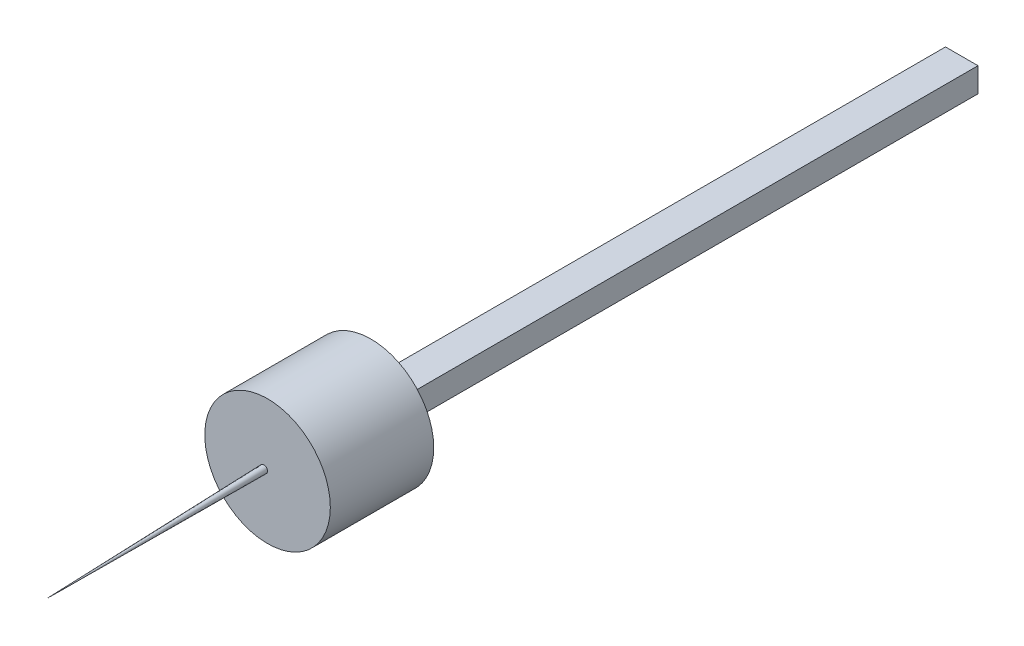
ISO-10303-21;
HEADER;
FILE_DESCRIPTION(('STEP AP214'),'2;1');
FILE_NAME('part.step','',(''),(''),'','','');
FILE_SCHEMA(('AUTOMOTIVE_DESIGN { 1 0 10303 214 1 1 1 1 }'));
ENDSEC;
DATA;
#1=APPLICATION_CONTEXT('core data for automotive mechanical design processes');
#2=APPLICATION_PROTOCOL_DEFINITION('international standard','automotive_design',2000,#1);
#3=PRODUCT_CONTEXT('',#1,'mechanical');
#4=PRODUCT('Part','Part','',(#3));
#5=PRODUCT_RELATED_PRODUCT_CATEGORY('part','',(#4));
#6=PRODUCT_DEFINITION_FORMATION('','',#4);
#7=PRODUCT_DEFINITION_CONTEXT('part definition',#1,'design');
#8=PRODUCT_DEFINITION('design','',#6,#7);
#9=PRODUCT_DEFINITION_SHAPE('','',#8);
#10=(LENGTH_UNIT() NAMED_UNIT(*) SI_UNIT(.MILLI.,.METRE.));
#11=(NAMED_UNIT(*) PLANE_ANGLE_UNIT() SI_UNIT($,.RADIAN.));
#12=(NAMED_UNIT(*) SI_UNIT($,.STERADIAN.) SOLID_ANGLE_UNIT());
#13=UNCERTAINTY_MEASURE_WITH_UNIT(LENGTH_MEASURE(1.E-05),#10,'distance_accuracy_value','');
#14=(GEOMETRIC_REPRESENTATION_CONTEXT(3) GLOBAL_UNCERTAINTY_ASSIGNED_CONTEXT((#13)) GLOBAL_UNIT_ASSIGNED_CONTEXT((#10,
#11,#12)) REPRESENTATION_CONTEXT('',''));
#15=CARTESIAN_POINT('',(0.,0.,0.));
#16=DIRECTION('',(0.,0.,1.));
#17=DIRECTION('',(1.,0.,0.));
#18=AXIS2_PLACEMENT_3D('',#15,#16,#17);
#19=CARTESIAN_POINT('',(-0.5,0.,94.));
#20=DIRECTION('',(0.0166643523339935,0.,0.9998611400396));
#21=DIRECTION('',(0.9998611400396,0.,-0.0166643523339935));
#22=AXIS2_PLACEMENT_3D('',#19,#20,#21);
#23=CONICAL_SURFACE('',#22,0.,1.55413120308097);
#24=CARTESIAN_POINT('',(-0.499861149680644,0.,94.0083310191613));
#25=DIRECTION('',(0.0166643523339935,0.,0.9998611400396));
#26=DIRECTION('',(0.9998611400396,0.,-0.0166643523339935));
#27=AXIS2_PLACEMENT_3D('',#24,#25,#26);
#28=CIRCLE('',#27,0.4999305700198);
#29=CARTESIAN_POINT('',(0.,0.,94.));
#30=VERTEX_POINT('',#29);
#31=EDGE_CURVE('E12',#30,#30,#28,.T.);
#32=ORIENTED_EDGE('',*,*,#31,.F.);
#33=EDGE_LOOP('',(#32));
#34=FACE_BOUND('',#33,.T.);
#35=CARTESIAN_POINT('',(-0.5,0.,94.));
#36=VERTEX_POINT('',#35);
#37=VERTEX_LOOP('',#36);
#38=FACE_BOUND('',#37,.T.);
#39=ADVANCED_FACE('F47',(#34,#38),#23,.T.);
#40=CARTESIAN_POINT('',(-0.499861149680644,0.,94.0083310191613));
#41=DIRECTION('',(-0.0166643523339935,0.,-0.9998611400396));
#42=DIRECTION('',(-0.9998611400396,0.,0.0166643523339935));
#43=AXIS2_PLACEMENT_3D('',#40,#41,#42);
#44=CONICAL_SURFACE('',#43,0.4999305700198,0.0166651237139407);
#45=CARTESIAN_POINT('',(0.,0.,124.));
#46=VERTEX_POINT('',#45);
#47=VERTEX_LOOP('',#46);
#48=FACE_BOUND('',#47,.T.);
#49=ORIENTED_EDGE('',*,*,#31,.T.);
#50=EDGE_LOOP('',(#49));
#51=FACE_BOUND('',#50,.T.);
#52=ADVANCED_FACE('F59',(#48,#51),#44,.T.);
#53=CLOSED_SHELL('',(#39,#52));
#54=MANIFOLD_SOLID_BREP('B2',#53);
#55=CARTESIAN_POINT('',(2.2,-1.65,80.));
#56=DIRECTION('',(-1.,0.,0.));
#57=DIRECTION('',(0.,0.,1.));
#58=AXIS2_PLACEMENT_3D('',#55,#56,#57);
#59=PLANE('',#58);
#60=DIRECTION('',(0.,1.,0.));
#61=VECTOR('',#60,1.);
#62=CARTESIAN_POINT('',(2.2,-1.65,0.));
#63=LINE('',#62,#61);
#64=CARTESIAN_POINT('',(2.2,-1.65,0.));
#65=VERTEX_POINT('',#64);
#66=CARTESIAN_POINT('',(2.2,1.65,0.));
#67=VERTEX_POINT('',#66);
#68=EDGE_CURVE('E144',#65,#67,#63,.T.);
#69=ORIENTED_EDGE('',*,*,#68,.T.);
#70=DIRECTION('',(0.,0.,-1.));
#71=VECTOR('',#70,1.);
#72=CARTESIAN_POINT('',(2.2,1.65,80.));
#73=LINE('',#72,#71);
#74=CARTESIAN_POINT('',(2.2,1.65,80.));
#75=VERTEX_POINT('',#74);
#76=EDGE_CURVE('E45',#75,#67,#73,.T.);
#77=ORIENTED_EDGE('',*,*,#76,.F.);
#78=DIRECTION('',(0.,1.,0.));
#79=VECTOR('',#78,1.);
#80=CARTESIAN_POINT('',(2.2,-1.65,80.));
#81=LINE('',#80,#79);
#82=CARTESIAN_POINT('',(2.2,-1.65,80.));
#83=VERTEX_POINT('',#82);
#84=EDGE_CURVE('E127',#83,#75,#81,.T.);
#85=ORIENTED_EDGE('',*,*,#84,.F.);
#86=DIRECTION('',(0.,0.,-1.));
#87=VECTOR('',#86,1.);
#88=CARTESIAN_POINT('',(2.2,-1.65,80.));
#89=LINE('',#88,#87);
#90=EDGE_CURVE('E129',#83,#65,#89,.T.);
#91=ORIENTED_EDGE('',*,*,#90,.T.);
#92=EDGE_LOOP('',(#69,#77,#85,#91));
#93=FACE_BOUND('',#92,.T.);
#94=ADVANCED_FACE('F79',(#93),#59,.F.);
#95=CARTESIAN_POINT('',(-2.2,1.65,80.));
#96=DIRECTION('',(0.,-1.,0.));
#97=DIRECTION('',(0.,0.,-1.));
#98=AXIS2_PLACEMENT_3D('',#95,#96,#97);
#99=PLANE('',#98);
#100=DIRECTION('',(-1.,0.,0.));
#101=VECTOR('',#100,1.);
#102=CARTESIAN_POINT('',(-2.2,1.65,0.));
#103=LINE('',#102,#101);
#104=CARTESIAN_POINT('',(-2.2,1.65,0.));
#105=VERTEX_POINT('',#104);
#106=EDGE_CURVE('E146',#67,#105,#103,.T.);
#107=ORIENTED_EDGE('',*,*,#106,.T.);
#108=DIRECTION('',(0.,0.,-1.));
#109=VECTOR('',#108,1.);
#110=CARTESIAN_POINT('',(-2.2,1.65,80.));
#111=LINE('',#110,#109);
#112=CARTESIAN_POINT('',(-2.2,1.65,80.));
#113=VERTEX_POINT('',#112);
#114=EDGE_CURVE('E87',#113,#105,#111,.T.);
#115=ORIENTED_EDGE('',*,*,#114,.F.);
#116=DIRECTION('',(-1.,0.,0.));
#117=VECTOR('',#116,1.);
#118=CARTESIAN_POINT('',(-2.2,1.65,80.));
#119=LINE('',#118,#117);
#120=EDGE_CURVE('E121',#75,#113,#119,.T.);
#121=ORIENTED_EDGE('',*,*,#120,.F.);
#122=ORIENTED_EDGE('',*,*,#76,.T.);
#123=EDGE_LOOP('',(#107,#115,#121,#122));
#124=FACE_BOUND('',#123,.T.);
#125=ADVANCED_FACE('F154',(#124),#99,.F.);
#126=CARTESIAN_POINT('',(-2.2,-1.65,80.));
#127=DIRECTION('',(1.,0.,0.));
#128=DIRECTION('',(0.,0.,-1.));
#129=AXIS2_PLACEMENT_3D('',#126,#127,#128);
#130=PLANE('',#129);
#131=DIRECTION('',(0.,-1.,0.));
#132=VECTOR('',#131,1.);
#133=CARTESIAN_POINT('',(-2.2,-1.65,0.));
#134=LINE('',#133,#132);
#135=CARTESIAN_POINT('',(-2.2,-1.65,0.));
#136=VERTEX_POINT('',#135);
#137=EDGE_CURVE('E111',#105,#136,#134,.T.);
#138=ORIENTED_EDGE('',*,*,#137,.T.);
#139=DIRECTION('',(0.,0.,-1.));
#140=VECTOR('',#139,1.);
#141=CARTESIAN_POINT('',(-2.2,-1.65,80.));
#142=LINE('',#141,#140);
#143=CARTESIAN_POINT('',(-2.2,-1.65,80.));
#144=VERTEX_POINT('',#143);
#145=EDGE_CURVE('E95',#144,#136,#142,.T.);
#146=ORIENTED_EDGE('',*,*,#145,.F.);
#147=DIRECTION('',(0.,-1.,0.));
#148=VECTOR('',#147,1.);
#149=CARTESIAN_POINT('',(-2.2,-1.65,80.));
#150=LINE('',#149,#148);
#151=EDGE_CURVE('E139',#113,#144,#150,.T.);
#152=ORIENTED_EDGE('',*,*,#151,.F.);
#153=ORIENTED_EDGE('',*,*,#114,.T.);
#154=EDGE_LOOP('',(#138,#146,#152,#153));
#155=FACE_BOUND('',#154,.T.);
#156=ADVANCED_FACE('F151',(#155),#130,.F.);
#157=CARTESIAN_POINT('',(-2.2,-1.65,80.));
#158=DIRECTION('',(0.,1.,0.));
#159=DIRECTION('',(0.,0.,1.));
#160=AXIS2_PLACEMENT_3D('',#157,#158,#159);
#161=PLANE('',#160);
#162=DIRECTION('',(1.,0.,0.));
#163=VECTOR('',#162,1.);
#164=CARTESIAN_POINT('',(-2.2,-1.65,0.));
#165=LINE('',#164,#163);
#166=EDGE_CURVE('E116',#136,#65,#165,.T.);
#167=ORIENTED_EDGE('',*,*,#166,.T.);
#168=ORIENTED_EDGE('',*,*,#90,.F.);
#169=DIRECTION('',(1.,0.,0.));
#170=VECTOR('',#169,1.);
#171=CARTESIAN_POINT('',(-2.2,-1.65,80.));
#172=LINE('',#171,#170);
#173=EDGE_CURVE('E135',#144,#83,#172,.T.);
#174=ORIENTED_EDGE('',*,*,#173,.F.);
#175=ORIENTED_EDGE('',*,*,#145,.T.);
#176=EDGE_LOOP('',(#167,#168,#174,#175));
#177=FACE_BOUND('',#176,.T.);
#178=ADVANCED_FACE('F134',(#177),#161,.F.);
#179=CARTESIAN_POINT('',(0.,0.,0.));
#180=DIRECTION('',(0.,0.,-1.));
#181=DIRECTION('',(-1.,0.,0.));
#182=AXIS2_PLACEMENT_3D('',#179,#180,#181);
#183=PLANE('',#182);
#184=ORIENTED_EDGE('',*,*,#68,.F.);
#185=ORIENTED_EDGE('',*,*,#166,.F.);
#186=ORIENTED_EDGE('',*,*,#137,.F.);
#187=ORIENTED_EDGE('',*,*,#106,.F.);
#188=EDGE_LOOP('',(#184,#185,#186,#187));
#189=FACE_BOUND('',#188,.T.);
#190=ADVANCED_FACE('F153',(#189),#183,.T.);
#191=CARTESIAN_POINT('',(0.,0.,80.));
#192=DIRECTION('',(0.,0.,1.));
#193=DIRECTION('',(1.,0.,0.));
#194=AXIS2_PLACEMENT_3D('',#191,#192,#193);
#195=PLANE('',#194);
#196=CARTESIAN_POINT('',(0.,0.,80.));
#197=DIRECTION('',(0.,0.,1.));
#198=DIRECTION('',(1.,0.,0.));
#199=AXIS2_PLACEMENT_3D('',#196,#197,#198);
#200=CIRCLE('',#199,8.5);
#201=CARTESIAN_POINT('',(8.5,0.,80.));
#202=VERTEX_POINT('',#201);
#203=EDGE_CURVE('E180',#202,#202,#200,.T.);
#204=ORIENTED_EDGE('',*,*,#203,.F.);
#205=EDGE_LOOP('',(#204));
#206=FACE_BOUND('',#205,.T.);
#207=ORIENTED_EDGE('',*,*,#173,.T.);
#208=ORIENTED_EDGE('',*,*,#84,.T.);
#209=ORIENTED_EDGE('',*,*,#120,.T.);
#210=ORIENTED_EDGE('',*,*,#151,.T.);
#211=EDGE_LOOP('',(#207,#208,#209,#210));
#212=FACE_BOUND('',#211,.T.);
#213=ADVANCED_FACE('F138',(#206,#212),#195,.F.);
#214=CARTESIAN_POINT('',(0.,0.,94.));
#215=DIRECTION('',(0.,0.,-1.));
#216=DIRECTION('',(-1.,0.,0.));
#217=AXIS2_PLACEMENT_3D('',#214,#215,#216);
#218=CYLINDRICAL_SURFACE('',#217,8.5);
#219=CARTESIAN_POINT('',(0.,0.,94.));
#220=DIRECTION('',(0.,0.,1.));
#221=DIRECTION('',(1.,0.,0.));
#222=AXIS2_PLACEMENT_3D('',#219,#220,#221);
#223=CIRCLE('',#222,8.5);
#224=CARTESIAN_POINT('',(8.5,0.,94.));
#225=VERTEX_POINT('',#224);
#226=EDGE_CURVE('E147',#225,#225,#223,.T.);
#227=ORIENTED_EDGE('',*,*,#226,.F.);
#228=EDGE_LOOP('',(#227));
#229=FACE_BOUND('',#228,.T.);
#230=ORIENTED_EDGE('',*,*,#203,.T.);
#231=EDGE_LOOP('',(#230));
#232=FACE_BOUND('',#231,.T.);
#233=ADVANCED_FACE('F166',(#229,#232),#218,.T.);
#234=CARTESIAN_POINT('',(0.,0.,94.));
#235=DIRECTION('',(0.,0.,1.));
#236=DIRECTION('',(1.,0.,0.));
#237=AXIS2_PLACEMENT_3D('',#234,#235,#236);
#238=PLANE('',#237);
#239=ORIENTED_EDGE('',*,*,#226,.T.);
#240=EDGE_LOOP('',(#239));
#241=FACE_BOUND('',#240,.T.);
#242=ADVANCED_FACE('F169',(#241),#238,.T.);
#243=CLOSED_SHELL('',(#94,#125,#156,#178,#190,#213,#233,#242));
#244=MANIFOLD_SOLID_BREP('B6',#243);
#245=ADVANCED_BREP_SHAPE_REPRESENTATION('',(#18,#54,#244),#14);
#246=SHAPE_DEFINITION_REPRESENTATION(#9,#245);
ENDSEC;
END-ISO-10303-21;
